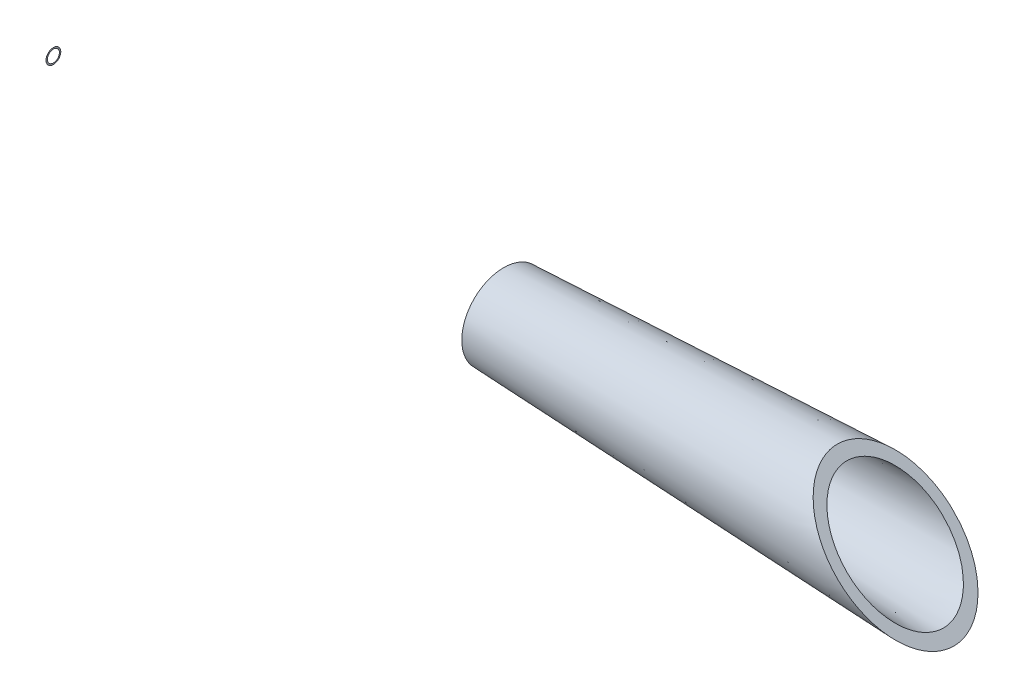
ISO-10303-21;
HEADER;
FILE_DESCRIPTION(('STEP AP214'),'2;1');
FILE_NAME('part.step','',(''),(''),'','','');
FILE_SCHEMA(('AUTOMOTIVE_DESIGN { 1 0 10303 214 1 1 1 1 }'));
ENDSEC;
DATA;
#1=APPLICATION_CONTEXT('core data for automotive mechanical design processes');
#2=APPLICATION_PROTOCOL_DEFINITION('international standard','automotive_design',2000,#1);
#3=PRODUCT_CONTEXT('',#1,'mechanical');
#4=PRODUCT('Part','Part','',(#3));
#5=PRODUCT_RELATED_PRODUCT_CATEGORY('part','',(#4));
#6=PRODUCT_DEFINITION_FORMATION('','',#4);
#7=PRODUCT_DEFINITION_CONTEXT('part definition',#1,'design');
#8=PRODUCT_DEFINITION('design','',#6,#7);
#9=PRODUCT_DEFINITION_SHAPE('','',#8);
#10=(LENGTH_UNIT() NAMED_UNIT(*) SI_UNIT(.MILLI.,.METRE.));
#11=(NAMED_UNIT(*) PLANE_ANGLE_UNIT() SI_UNIT($,.RADIAN.));
#12=(NAMED_UNIT(*) SI_UNIT($,.STERADIAN.) SOLID_ANGLE_UNIT());
#13=UNCERTAINTY_MEASURE_WITH_UNIT(LENGTH_MEASURE(1.E-05),#10,'distance_accuracy_value','');
#14=(GEOMETRIC_REPRESENTATION_CONTEXT(3) GLOBAL_UNCERTAINTY_ASSIGNED_CONTEXT((#13)) GLOBAL_UNIT_ASSIGNED_CONTEXT((#10,
#11,#12)) REPRESENTATION_CONTEXT('',''));
#15=CARTESIAN_POINT('',(0.,0.,0.));
#16=DIRECTION('',(0.,0.,1.));
#17=DIRECTION('',(1.,0.,0.));
#18=AXIS2_PLACEMENT_3D('',#15,#16,#17);
#19=CARTESIAN_POINT('',(50.,0.,0.));
#20=DIRECTION('',(1.,0.,0.));
#21=DIRECTION('',(0.,0.,-1.));
#22=AXIS2_PLACEMENT_3D('',#19,#20,#21);
#23=CONICAL_SURFACE('',#22,4.69458471716816,0.0418879020478642);
#24=CARTESIAN_POINT('',(168.259502044415,-0.404502044415188,0.));
#25=DIRECTION('',(-0.707106781186551,-0.707106781186544,0.));
#26=DIRECTION('',(0.707106781186544,-0.707106781186551,0.));
#27=AXIS2_PLACEMENT_3D('',#24,#25,#26);
#28=ELLIPSE('',#27,13.6487538529249,9.64264584877674);
#29=CARTESIAN_POINT('',(177.910628448564,-10.0556284485645,0.));
#30=VERTEX_POINT('',#29);
#31=EDGE_CURVE('E12',#30,#30,#28,.T.);
#32=ORIENTED_EDGE('',*,*,#31,.F.);
#33=EDGE_LOOP('',(#32));
#34=FACE_BOUND('',#33,.T.);
#35=CARTESIAN_POINT('',(90.,0.,0.));
#36=DIRECTION('',(1.,0.,0.));
#37=DIRECTION('',(0.,0.,-1.));
#38=AXIS2_PLACEMENT_3D('',#35,#36,#37);
#39=CIRCLE('',#38,6.37108143879974);
#40=CARTESIAN_POINT('',(90.,0.,-6.37108143879974));
#41=VERTEX_POINT('',#40);
#42=EDGE_CURVE('E67',#41,#41,#39,.T.);
#43=ORIENTED_EDGE('',*,*,#42,.F.);
#44=EDGE_LOOP('',(#43));
#45=FACE_BOUND('',#44,.T.);
#46=ADVANCED_FACE('F54',(#34,#45),#23,.F.);
#47=CARTESIAN_POINT('',(180.,0.,0.));
#48=DIRECTION('',(1.,0.,0.));
#49=DIRECTION('',(0.,0.,-1.));
#50=AXIS2_PLACEMENT_3D('',#47,#48,#49);
#51=CONICAL_SURFACE('',#50,12.1449549424782,0.0418879020478642);
#52=CARTESIAN_POINT('',(168.343548113267,-0.488548113266588,0.));
#53=DIRECTION('',(-0.707106781186551,-0.707106781186544,0.));
#54=DIRECTION('',(0.707106781186544,-0.707106781186551,0.));
#55=AXIS2_PLACEMENT_3D('',#52,#53,#54);
#56=ELLIPSE('',#55,16.4846458388776,11.6461622415986);
#57=CARTESIAN_POINT('',(179.999952971396,-12.1449529713956,0.));
#58=VERTEX_POINT('',#57);
#59=EDGE_CURVE('E57',#58,#58,#56,.F.);
#60=ORIENTED_EDGE('',*,*,#59,.F.);
#61=EDGE_LOOP('',(#60));
#62=FACE_BOUND('',#61,.T.);
#63=CARTESIAN_POINT('',(90.,0.,0.));
#64=DIRECTION('',(1.,0.,0.));
#65=DIRECTION('',(0.,0.,-1.));
#66=AXIS2_PLACEMENT_3D('',#63,#64,#65);
#67=CIRCLE('',#66,8.37283731880711);
#68=CARTESIAN_POINT('',(90.,0.,-8.37283731880711));
#69=VERTEX_POINT('',#68);
#70=EDGE_CURVE('E71',#69,#69,#67,.F.);
#71=ORIENTED_EDGE('',*,*,#70,.F.);
#72=EDGE_LOOP('',(#71));
#73=FACE_BOUND('',#72,.T.);
#74=ADVANCED_FACE('F78',(#62,#73),#51,.T.);
#75=CARTESIAN_POINT('',(90.,0.,0.));
#76=DIRECTION('',(1.,0.,0.));
#77=DIRECTION('',(0.,0.,-1.));
#78=AXIS2_PLACEMENT_3D('',#75,#76,#77);
#79=PLANE('',#78);
#80=ORIENTED_EDGE('',*,*,#42,.T.);
#81=EDGE_LOOP('',(#80));
#82=FACE_BOUND('',#81,.T.);
#83=ORIENTED_EDGE('',*,*,#70,.T.);
#84=EDGE_LOOP('',(#83));
#85=FACE_BOUND('',#84,.T.);
#86=ADVANCED_FACE('F76',(#82,#85),#79,.F.);
#87=CARTESIAN_POINT('',(83.9275000000009,83.9275,0.));
#88=DIRECTION('',(-0.707106781186551,-0.707106781186544,0.));
#89=DIRECTION('',(0.707106781186544,-0.707106781186551,0.));
#90=AXIS2_PLACEMENT_3D('',#87,#88,#89);
#91=PLANE('',#90);
#92=ORIENTED_EDGE('',*,*,#31,.T.);
#93=EDGE_LOOP('',(#92));
#94=FACE_BOUND('',#93,.T.);
#95=ORIENTED_EDGE('',*,*,#59,.T.);
#96=EDGE_LOOP('',(#95));
#97=FACE_BOUND('',#96,.T.);
#98=ADVANCED_FACE('F85',(#94,#97),#91,.F.);
#99=CLOSED_SHELL('',(#46,#74,#86,#98));
#100=MANIFOLD_SOLID_BREP('B2',#99);
#101=CARTESIAN_POINT('',(0.,0.,0.));
#102=DIRECTION('',(1.,0.,0.));
#103=DIRECTION('',(0.,0.,-1.));
#104=AXIS2_PLACEMENT_3D('',#101,#102,#103);
#105=PLANE('',#104);
#106=CARTESIAN_POINT('',(0.,0.,0.));
#107=DIRECTION('',(-1.,0.,0.));
#108=DIRECTION('',(0.,0.,1.));
#109=AXIS2_PLACEMENT_3D('',#106,#107,#108);
#110=CIRCLE('',#109,1.2);
#111=CARTESIAN_POINT('',(0.,0.,1.2));
#112=VERTEX_POINT('',#111);
#113=EDGE_CURVE('E132',#112,#112,#110,.T.);
#114=ORIENTED_EDGE('',*,*,#113,.T.);
#115=EDGE_LOOP('',(#114));
#116=FACE_BOUND('',#115,.T.);
#117=CARTESIAN_POINT('',(0.,0.,0.));
#118=DIRECTION('',(1.,0.,0.));
#119=DIRECTION('',(0.,0.,-1.));
#120=AXIS2_PLACEMENT_3D('',#117,#118,#119);
#121=CIRCLE('',#120,1.47834620192007);
#122=CARTESIAN_POINT('',(0.,0.,-1.47834620192007));
#123=VERTEX_POINT('',#122);
#124=EDGE_CURVE('E53',#123,#123,#121,.T.);
#125=ORIENTED_EDGE('',*,*,#124,.T.);
#126=EDGE_LOOP('',(#125));
#127=FACE_BOUND('',#126,.T.);
#128=ADVANCED_FACE('F128',(#116,#127),#105,.T.);
#129=CARTESIAN_POINT('',(1.99026806874157,0.,0.));
#130=DIRECTION('',(-1.,0.,0.));
#131=DIRECTION('',(0.,0.,1.));
#132=AXIS2_PLACEMENT_3D('',#129,#130,#131);
#133=DEGENERATE_TOROIDAL_SURFACE('',#132,1.33917310096007,1.99512810051965,.T.);
#134=ORIENTED_EDGE('',*,*,#113,.F.);
#135=EDGE_LOOP('',(#134));
#136=FACE_BOUND('',#135,.T.);
#137=ORIENTED_EDGE('',*,*,#124,.F.);
#138=EDGE_LOOP('',(#137));
#139=FACE_BOUND('',#138,.T.);
#140=ADVANCED_FACE('F130',(#136,#139),#133,.T.);
#141=CLOSED_SHELL('',(#128,#140));
#142=MANIFOLD_SOLID_BREP('B7',#141);
#143=ADVANCED_BREP_SHAPE_REPRESENTATION('',(#18,#100,#142),#14);
#144=SHAPE_DEFINITION_REPRESENTATION(#9,#143);
ENDSEC;
END-ISO-10303-21;
